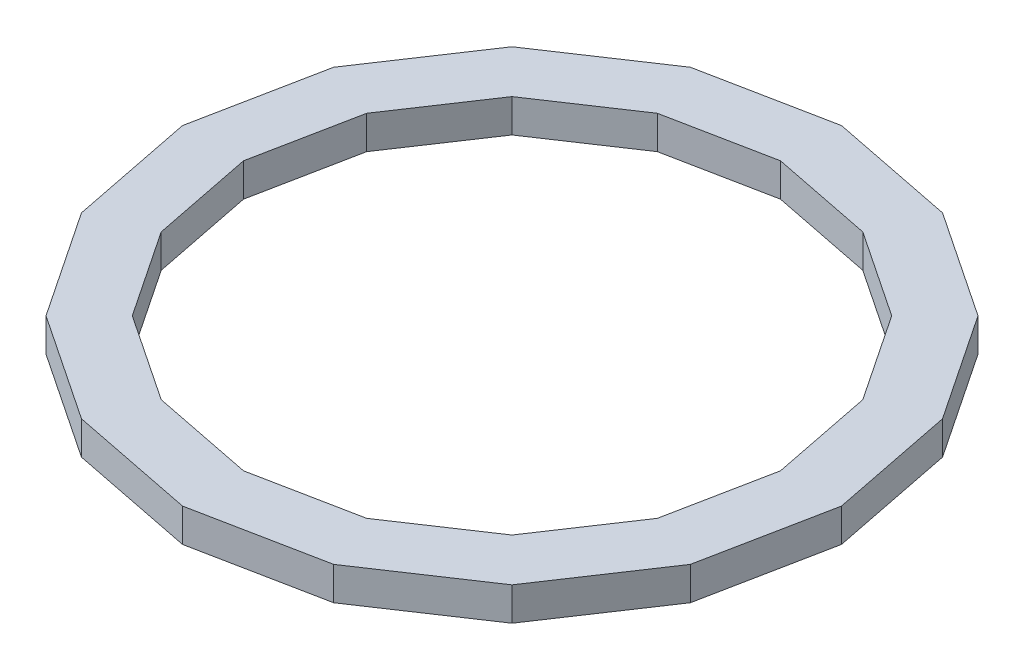
ISO-10303-21;
HEADER;
FILE_DESCRIPTION(('STEP AP214'),'2;1');
FILE_NAME('part.step','',(''),(''),'','','');
FILE_SCHEMA(('AUTOMOTIVE_DESIGN { 1 0 10303 214 1 1 1 1 }'));
ENDSEC;
DATA;
#1=APPLICATION_CONTEXT('core data for automotive mechanical design processes');
#2=APPLICATION_PROTOCOL_DEFINITION('international standard','automotive_design',2000,#1);
#3=PRODUCT_CONTEXT('',#1,'mechanical');
#4=PRODUCT('Part','Part','',(#3));
#5=PRODUCT_RELATED_PRODUCT_CATEGORY('part','',(#4));
#6=PRODUCT_DEFINITION_FORMATION('','',#4);
#7=PRODUCT_DEFINITION_CONTEXT('part definition',#1,'design');
#8=PRODUCT_DEFINITION('design','',#6,#7);
#9=PRODUCT_DEFINITION_SHAPE('','',#8);
#10=(LENGTH_UNIT() NAMED_UNIT(*) SI_UNIT(.MILLI.,.METRE.));
#11=(NAMED_UNIT(*) PLANE_ANGLE_UNIT() SI_UNIT($,.RADIAN.));
#12=(NAMED_UNIT(*) SI_UNIT($,.STERADIAN.) SOLID_ANGLE_UNIT());
#13=UNCERTAINTY_MEASURE_WITH_UNIT(LENGTH_MEASURE(1.E-05),#10,'distance_accuracy_value','');
#14=(GEOMETRIC_REPRESENTATION_CONTEXT(3) GLOBAL_UNCERTAINTY_ASSIGNED_CONTEXT((#13)) GLOBAL_UNIT_ASSIGNED_CONTEXT((#10,
#11,#12)) REPRESENTATION_CONTEXT('',''));
#15=CARTESIAN_POINT('',(0.,0.,0.));
#16=DIRECTION('',(0.,0.,1.));
#17=DIRECTION('',(1.,0.,0.));
#18=AXIS2_PLACEMENT_3D('',#15,#16,#17);
#19=CARTESIAN_POINT('',(0.,19.05,0.));
#20=DIRECTION('',(0.,1.,0.));
#21=DIRECTION('',(0.,0.,1.));
#22=AXIS2_PLACEMENT_3D('',#19,#20,#21);
#23=PLANE('',#22);
#24=DIRECTION('',(0.195090322016117,0.,-0.980785280403233));
#25=VECTOR('',#24,1.);
#26=CARTESIAN_POINT('',(174.413998760932,19.05,72.2446437545));
#27=LINE('',#26,#25);
#28=CARTESIAN_POINT('',(174.413998760932,19.05,72.2446437545));
#29=VERTEX_POINT('',#28);
#30=CARTESIAN_POINT('',(188.784351880639,19.05,-2.06772330459707E-12));
#31=VERTEX_POINT('',#30);
#32=EDGE_CURVE('E367',#29,#31,#27,.T.);
#33=ORIENTED_EDGE('',*,*,#32,.T.);
#34=DIRECTION('',(-0.195090322016139,0.,-0.980785280403228));
#35=VECTOR('',#34,1.);
#36=CARTESIAN_POINT('',(188.784351880639,19.05,-2.06772330459707E-12));
#37=LINE('',#36,#35);
#38=CARTESIAN_POINT('',(174.41399876093,19.05,-72.2446437545037));
#39=VERTEX_POINT('',#38);
#40=EDGE_CURVE('E370',#31,#39,#37,.T.);
#41=ORIENTED_EDGE('',*,*,#40,.T.);
#42=DIRECTION('',(-0.555570233019612,0.,-0.831469612302539));
#43=VECTOR('',#42,1.);
#44=CARTESIAN_POINT('',(174.41399876093,19.05,-72.2446437545037));
#45=LINE('',#44,#43);
#46=CARTESIAN_POINT('',(133.490695396706,19.05,-133.490695396709));
#47=VERTEX_POINT('',#46);
#48=EDGE_CURVE('E373',#39,#47,#45,.T.);
#49=ORIENTED_EDGE('',*,*,#48,.T.);
#50=DIRECTION('',(-0.831469612302551,0.,-0.555570233019593));
#51=VECTOR('',#50,1.);
#52=CARTESIAN_POINT('',(133.490695396706,19.05,-133.490695396709));
#53=LINE('',#52,#51);
#54=CARTESIAN_POINT('',(72.2446437544997,19.05,-174.413998760932));
#55=VERTEX_POINT('',#54);
#56=EDGE_CURVE('E375',#47,#55,#53,.T.);
#57=ORIENTED_EDGE('',*,*,#56,.T.);
#58=DIRECTION('',(-0.980785280403233,0.,-0.195090322016118));
#59=VECTOR('',#58,1.);
#60=CARTESIAN_POINT('',(72.2446437544997,19.05,-174.413998760932));
#61=LINE('',#60,#59);
#62=CARTESIAN_POINT('',(-2.12348109558965E-12,19.05,-188.784351880639));
#63=VERTEX_POINT('',#62);
#64=EDGE_CURVE('E377',#55,#63,#61,.T.);
#65=ORIENTED_EDGE('',*,*,#64,.T.);
#66=DIRECTION('',(-0.980785280403228,0.,0.195090322016139));
#67=VECTOR('',#66,1.);
#68=CARTESIAN_POINT('',(-2.12348109558965E-12,19.05,-188.784351880639));
#69=LINE('',#68,#67);
#70=CARTESIAN_POINT('',(-72.2446437545038,19.05,-174.41399876093));
#71=VERTEX_POINT('',#70);
#72=EDGE_CURVE('E379',#63,#71,#69,.T.);
#73=ORIENTED_EDGE('',*,*,#72,.T.);
#74=DIRECTION('',(-0.831469612302539,0.,0.555570233019611));
#75=VECTOR('',#74,1.);
#76=CARTESIAN_POINT('',(-72.2446437545038,19.05,-174.41399876093));
#77=LINE('',#76,#75);
#78=CARTESIAN_POINT('',(-133.490695396709,19.05,-133.490695396706));
#79=VERTEX_POINT('',#78);
#80=EDGE_CURVE('E381',#71,#79,#77,.T.);
#81=ORIENTED_EDGE('',*,*,#80,.T.);
#82=DIRECTION('',(-0.555570233019593,0.,0.831469612302551));
#83=VECTOR('',#82,1.);
#84=CARTESIAN_POINT('',(-133.490695396709,19.05,-133.490695396706));
#85=LINE('',#84,#83);
#86=CARTESIAN_POINT('',(-174.413998760932,19.05,-72.2446437545));
#87=VERTEX_POINT('',#86);
#88=EDGE_CURVE('E383',#79,#87,#85,.T.);
#89=ORIENTED_EDGE('',*,*,#88,.T.);
#90=DIRECTION('',(-0.195090322016117,0.,0.980785280403233));
#91=VECTOR('',#90,1.);
#92=CARTESIAN_POINT('',(-174.413998760932,19.05,-72.2446437545));
#93=LINE('',#92,#91);
#94=CARTESIAN_POINT('',(-188.784351880639,19.05,2.15799439684234E-12));
#95=VERTEX_POINT('',#94);
#96=EDGE_CURVE('E385',#87,#95,#93,.T.);
#97=ORIENTED_EDGE('',*,*,#96,.T.);
#98=DIRECTION('',(0.195090322016139,0.,0.980785280403228));
#99=VECTOR('',#98,1.);
#100=CARTESIAN_POINT('',(-188.784351880639,19.05,2.15799439684234E-12));
#101=LINE('',#100,#99);
#102=CARTESIAN_POINT('',(-174.41399876093,19.05,72.2446437545039));
#103=VERTEX_POINT('',#102);
#104=EDGE_CURVE('E387',#95,#103,#101,.T.);
#105=ORIENTED_EDGE('',*,*,#104,.T.);
#106=DIRECTION('',(0.555570233019612,0.,0.831469612302539));
#107=VECTOR('',#106,1.);
#108=CARTESIAN_POINT('',(-174.41399876093,19.05,72.2446437545039));
#109=LINE('',#108,#107);
#110=CARTESIAN_POINT('',(-133.490695396706,19.05,133.490695396709));
#111=VERTEX_POINT('',#110);
#112=EDGE_CURVE('E389',#103,#111,#109,.T.);
#113=ORIENTED_EDGE('',*,*,#112,.T.);
#114=DIRECTION('',(0.831469612302551,0.,0.555570233019593));
#115=VECTOR('',#114,1.);
#116=CARTESIAN_POINT('',(-133.490695396706,19.05,133.490695396709));
#117=LINE('',#116,#115);
#118=CARTESIAN_POINT('',(-72.2446437544999,19.05,174.413998760932));
#119=VERTEX_POINT('',#118);
#120=EDGE_CURVE('E391',#111,#119,#117,.T.);
#121=ORIENTED_EDGE('',*,*,#120,.T.);
#122=DIRECTION('',(0.980785280403233,0.,0.195090322016118));
#123=VECTOR('',#122,1.);
#124=CARTESIAN_POINT('',(-72.2446437544999,19.05,174.413998760932));
#125=LINE('',#124,#123);
#126=CARTESIAN_POINT('',(2.13703640645496E-12,19.05,188.784351880639));
#127=VERTEX_POINT('',#126);
#128=EDGE_CURVE('E393',#119,#127,#125,.T.);
#129=ORIENTED_EDGE('',*,*,#128,.T.);
#130=DIRECTION('',(0.980785280403228,0.,-0.195090322016139));
#131=VECTOR('',#130,1.);
#132=CARTESIAN_POINT('',(2.13703640645496E-12,19.05,188.784351880639));
#133=LINE('',#132,#131);
#134=CARTESIAN_POINT('',(72.2446437545038,19.05,174.41399876093));
#135=VERTEX_POINT('',#134);
#136=EDGE_CURVE('E395',#127,#135,#133,.T.);
#137=ORIENTED_EDGE('',*,*,#136,.T.);
#138=DIRECTION('',(0.831469612302539,0.,-0.555570233019611));
#139=VECTOR('',#138,1.);
#140=CARTESIAN_POINT('',(72.2446437545038,19.05,174.41399876093));
#141=LINE('',#140,#139);
#142=CARTESIAN_POINT('',(133.490695396709,19.05,133.490695396706));
#143=VERTEX_POINT('',#142);
#144=EDGE_CURVE('E397',#135,#143,#141,.T.);
#145=ORIENTED_EDGE('',*,*,#144,.T.);
#146=DIRECTION('',(0.555570233019593,0.,-0.831469612302551));
#147=VECTOR('',#146,1.);
#148=CARTESIAN_POINT('',(133.490695396709,19.05,133.490695396706));
#149=LINE('',#148,#147);
#150=EDGE_CURVE('E399',#143,#29,#149,.T.);
#151=ORIENTED_EDGE('',*,*,#150,.T.);
#152=EDGE_LOOP('',(#33,#41,#49,#57,#65,#73,#81,#89,#97,#105,#113,#121,#129,#137,#145,#151));
#153=FACE_BOUND('',#152,.T.);
#154=DIRECTION('',(-0.19509032201614,0.,-0.980785280403228));
#155=VECTOR('',#154,1.);
#156=CARTESIAN_POINT('',(153.822571065676,19.05,-1.83885030120495E-12));
#157=LINE('',#156,#155);
#158=CARTESIAN_POINT('',(153.822571065676,19.05,-1.83885030120495E-12));
#159=VERTEX_POINT('',#158);
#160=CARTESIAN_POINT('',(142.11352504584,19.05,-58.8653494706375));
#161=VERTEX_POINT('',#160);
#162=EDGE_CURVE('E251',#159,#161,#157,.T.);
#163=ORIENTED_EDGE('',*,*,#162,.F.);
#164=DIRECTION('',(0.195090322016117,0.,-0.980785280403233));
#165=VECTOR('',#164,1.);
#166=CARTESIAN_POINT('',(142.113525045842,19.05,58.8653494706343));
#167=LINE('',#166,#165);
#168=CARTESIAN_POINT('',(142.113525045842,19.05,58.8653494706343));
#169=VERTEX_POINT('',#168);
#170=EDGE_CURVE('E243',#169,#159,#167,.T.);
#171=ORIENTED_EDGE('',*,*,#170,.F.);
#172=DIRECTION('',(0.555570233019593,0.,-0.831469612302552));
#173=VECTOR('',#172,1.);
#174=CARTESIAN_POINT('',(108.76898310009,19.05,108.768983100088));
#175=LINE('',#174,#173);
#176=CARTESIAN_POINT('',(108.76898310009,19.05,108.768983100088));
#177=VERTEX_POINT('',#176);
#178=EDGE_CURVE('E293',#177,#169,#175,.T.);
#179=ORIENTED_EDGE('',*,*,#178,.F.);
#180=DIRECTION('',(0.831469612302539,0.,-0.555570233019612));
#181=VECTOR('',#180,1.);
#182=CARTESIAN_POINT('',(58.8653494706375,19.05,142.11352504584));
#183=LINE('',#182,#181);
#184=CARTESIAN_POINT('',(58.8653494706375,19.05,142.11352504584));
#185=VERTEX_POINT('',#184);
#186=EDGE_CURVE('E291',#185,#177,#183,.T.);
#187=ORIENTED_EDGE('',*,*,#186,.F.);
#188=DIRECTION('',(0.980785280403228,0.,-0.19509032201614));
#189=VECTOR('',#188,1.);
#190=CARTESIAN_POINT('',(1.76701626226146E-12,19.05,153.822571065676));
#191=LINE('',#190,#189);
#192=CARTESIAN_POINT('',(1.76701626226146E-12,19.05,153.822571065676));
#193=VERTEX_POINT('',#192);
#194=EDGE_CURVE('E289',#193,#185,#191,.T.);
#195=ORIENTED_EDGE('',*,*,#194,.F.);
#196=DIRECTION('',(0.980785280403233,0.,0.195090322016117));
#197=VECTOR('',#196,1.);
#198=CARTESIAN_POINT('',(-58.8653494706342,19.05,142.113525045842));
#199=LINE('',#198,#197);
#200=CARTESIAN_POINT('',(-58.8653494706342,19.05,142.113525045842));
#201=VERTEX_POINT('',#200);
#202=EDGE_CURVE('E287',#201,#193,#199,.T.);
#203=ORIENTED_EDGE('',*,*,#202,.F.);
#204=DIRECTION('',(0.831469612302552,0.,0.555570233019593));
#205=VECTOR('',#204,1.);
#206=CARTESIAN_POINT('',(-108.768983100088,19.05,108.76898310009));
#207=LINE('',#206,#205);
#208=CARTESIAN_POINT('',(-108.768983100088,19.05,108.76898310009));
#209=VERTEX_POINT('',#208);
#210=EDGE_CURVE('E285',#209,#201,#207,.T.);
#211=ORIENTED_EDGE('',*,*,#210,.F.);
#212=DIRECTION('',(0.555570233019612,0.,0.831469612302539));
#213=VECTOR('',#212,1.);
#214=CARTESIAN_POINT('',(-142.11352504584,19.05,58.8653494706376));
#215=LINE('',#214,#213);
#216=CARTESIAN_POINT('',(-142.11352504584,19.05,58.8653494706376));
#217=VERTEX_POINT('',#216);
#218=EDGE_CURVE('E283',#217,#209,#215,.T.);
#219=ORIENTED_EDGE('',*,*,#218,.F.);
#220=DIRECTION('',(0.19509032201614,0.,0.980785280403228));
#221=VECTOR('',#220,1.);
#222=CARTESIAN_POINT('',(-153.822571065676,19.05,1.7398533574002E-12));
#223=LINE('',#222,#221);
#224=CARTESIAN_POINT('',(-153.822571065676,19.05,1.7398533574002E-12));
#225=VERTEX_POINT('',#224);
#226=EDGE_CURVE('E280',#225,#217,#223,.T.);
#227=ORIENTED_EDGE('',*,*,#226,.F.);
#228=DIRECTION('',(-0.195090322016118,0.,0.980785280403233));
#229=VECTOR('',#228,1.);
#230=CARTESIAN_POINT('',(-142.113525045842,19.05,-58.8653494706341));
#231=LINE('',#230,#229);
#232=CARTESIAN_POINT('',(-142.113525045842,19.05,-58.8653494706341));
#233=VERTEX_POINT('',#232);
#234=EDGE_CURVE('E278',#233,#225,#231,.T.);
#235=ORIENTED_EDGE('',*,*,#234,.F.);
#236=DIRECTION('',(-0.555570233019593,0.,0.831469612302552));
#237=VECTOR('',#236,1.);
#238=CARTESIAN_POINT('',(-108.76898310009,19.05,-108.768983100088));
#239=LINE('',#238,#237);
#240=CARTESIAN_POINT('',(-108.76898310009,19.05,-108.768983100088));
#241=VERTEX_POINT('',#240);
#242=EDGE_CURVE('E276',#241,#233,#239,.T.);
#243=ORIENTED_EDGE('',*,*,#242,.F.);
#244=DIRECTION('',(-0.831469612302539,0.,0.555570233019612));
#245=VECTOR('',#244,1.);
#246=CARTESIAN_POINT('',(-58.8653494706374,19.05,-142.11352504584));
#247=LINE('',#246,#245);
#248=CARTESIAN_POINT('',(-58.8653494706374,19.05,-142.11352504584));
#249=VERTEX_POINT('',#248);
#250=EDGE_CURVE('E274',#249,#241,#247,.T.);
#251=ORIENTED_EDGE('',*,*,#250,.F.);
#252=DIRECTION('',(-0.980785280403228,0.,0.19509032201614));
#253=VECTOR('',#252,1.);
#254=CARTESIAN_POINT('',(-1.79028854164024E-12,19.05,-153.822571065676));
#255=LINE('',#254,#253);
#256=CARTESIAN_POINT('',(-1.79028854164024E-12,19.05,-153.822571065676));
#257=VERTEX_POINT('',#256);
#258=EDGE_CURVE('E272',#257,#249,#255,.T.);
#259=ORIENTED_EDGE('',*,*,#258,.F.);
#260=DIRECTION('',(-0.980785280403233,0.,-0.195090322016117));
#261=VECTOR('',#260,1.);
#262=CARTESIAN_POINT('',(58.8653494706345,19.05,-142.113525045841));
#263=LINE('',#262,#261);
#264=CARTESIAN_POINT('',(58.8653494706345,19.05,-142.113525045841));
#265=VERTEX_POINT('',#264);
#266=EDGE_CURVE('E270',#265,#257,#263,.T.);
#267=ORIENTED_EDGE('',*,*,#266,.F.);
#268=DIRECTION('',(-0.831469612302551,0.,-0.555570233019593));
#269=VECTOR('',#268,1.);
#270=CARTESIAN_POINT('',(108.768983100088,19.05,-108.76898310009));
#271=LINE('',#270,#269);
#272=CARTESIAN_POINT('',(108.768983100088,19.05,-108.76898310009));
#273=VERTEX_POINT('',#272);
#274=EDGE_CURVE('E266',#273,#265,#271,.T.);
#275=ORIENTED_EDGE('',*,*,#274,.F.);
#276=DIRECTION('',(-0.555570233019612,0.,-0.831469612302539));
#277=VECTOR('',#276,1.);
#278=CARTESIAN_POINT('',(142.11352504584,19.05,-58.8653494706375));
#279=LINE('',#278,#277);
#280=EDGE_CURVE('E264',#161,#273,#279,.T.);
#281=ORIENTED_EDGE('',*,*,#280,.F.);
#282=EDGE_LOOP('',(#163,#171,#179,#187,#195,#203,#211,#219,#227,#235,#243,#251,#259,#267,#275,#281));
#283=FACE_BOUND('',#282,.T.);
#284=ADVANCED_FACE('F34',(#153,#283),#23,.T.);
#285=CARTESIAN_POINT('',(0.,0.,0.));
#286=DIRECTION('',(0.,1.,0.));
#287=DIRECTION('',(0.,0.,1.));
#288=AXIS2_PLACEMENT_3D('',#285,#286,#287);
#289=PLANE('',#288);
#290=DIRECTION('',(0.195090322016117,0.,-0.980785280403233));
#291=VECTOR('',#290,1.);
#292=CARTESIAN_POINT('',(174.413998760932,0.,72.2446437545));
#293=LINE('',#292,#291);
#294=CARTESIAN_POINT('',(174.413998760932,0.,72.2446437545));
#295=VERTEX_POINT('',#294);
#296=CARTESIAN_POINT('',(188.784351880639,0.,-2.06772330459707E-12));
#297=VERTEX_POINT('',#296);
#298=EDGE_CURVE('E259',#295,#297,#293,.T.);
#299=ORIENTED_EDGE('',*,*,#298,.F.);
#300=DIRECTION('',(0.555570233019593,0.,-0.831469612302551));
#301=VECTOR('',#300,1.);
#302=CARTESIAN_POINT('',(133.490695396709,0.,133.490695396706));
#303=LINE('',#302,#301);
#304=CARTESIAN_POINT('',(133.490695396709,0.,133.490695396706));
#305=VERTEX_POINT('',#304);
#306=EDGE_CURVE('E371',#305,#295,#303,.T.);
#307=ORIENTED_EDGE('',*,*,#306,.F.);
#308=DIRECTION('',(0.831469612302539,0.,-0.555570233019611));
#309=VECTOR('',#308,1.);
#310=CARTESIAN_POINT('',(72.2446437545038,0.,174.41399876093));
#311=LINE('',#310,#309);
#312=CARTESIAN_POINT('',(72.2446437545038,0.,174.41399876093));
#313=VERTEX_POINT('',#312);
#314=EDGE_CURVE('E432',#313,#305,#311,.T.);
#315=ORIENTED_EDGE('',*,*,#314,.F.);
#316=DIRECTION('',(0.980785280403228,0.,-0.195090322016139));
#317=VECTOR('',#316,1.);
#318=CARTESIAN_POINT('',(2.13703640645496E-12,0.,188.784351880639));
#319=LINE('',#318,#317);
#320=CARTESIAN_POINT('',(2.13703640645496E-12,0.,188.784351880639));
#321=VERTEX_POINT('',#320);
#322=EDGE_CURVE('E430',#321,#313,#319,.T.);
#323=ORIENTED_EDGE('',*,*,#322,.F.);
#324=DIRECTION('',(0.980785280403233,0.,0.195090322016118));
#325=VECTOR('',#324,1.);
#326=CARTESIAN_POINT('',(-72.2446437544999,0.,174.413998760932));
#327=LINE('',#326,#325);
#328=CARTESIAN_POINT('',(-72.2446437544999,0.,174.413998760932));
#329=VERTEX_POINT('',#328);
#330=EDGE_CURVE('E428',#329,#321,#327,.T.);
#331=ORIENTED_EDGE('',*,*,#330,.F.);
#332=DIRECTION('',(0.831469612302551,0.,0.555570233019593));
#333=VECTOR('',#332,1.);
#334=CARTESIAN_POINT('',(-133.490695396706,0.,133.490695396709));
#335=LINE('',#334,#333);
#336=CARTESIAN_POINT('',(-133.490695396706,0.,133.490695396709));
#337=VERTEX_POINT('',#336);
#338=EDGE_CURVE('E426',#337,#329,#335,.T.);
#339=ORIENTED_EDGE('',*,*,#338,.F.);
#340=DIRECTION('',(0.555570233019612,0.,0.831469612302539));
#341=VECTOR('',#340,1.);
#342=CARTESIAN_POINT('',(-174.41399876093,0.,72.2446437545039));
#343=LINE('',#342,#341);
#344=CARTESIAN_POINT('',(-174.41399876093,0.,72.2446437545039));
#345=VERTEX_POINT('',#344);
#346=EDGE_CURVE('E424',#345,#337,#343,.T.);
#347=ORIENTED_EDGE('',*,*,#346,.F.);
#348=DIRECTION('',(0.195090322016139,0.,0.980785280403228));
#349=VECTOR('',#348,1.);
#350=CARTESIAN_POINT('',(-188.784351880639,0.,2.15799439684234E-12));
#351=LINE('',#350,#349);
#352=CARTESIAN_POINT('',(-188.784351880639,0.,2.15799439684234E-12));
#353=VERTEX_POINT('',#352);
#354=EDGE_CURVE('E422',#353,#345,#351,.T.);
#355=ORIENTED_EDGE('',*,*,#354,.F.);
#356=DIRECTION('',(-0.195090322016117,0.,0.980785280403233));
#357=VECTOR('',#356,1.);
#358=CARTESIAN_POINT('',(-174.413998760932,0.,-72.2446437545));
#359=LINE('',#358,#357);
#360=CARTESIAN_POINT('',(-174.413998760932,0.,-72.2446437545));
#361=VERTEX_POINT('',#360);
#362=EDGE_CURVE('E419',#361,#353,#359,.T.);
#363=ORIENTED_EDGE('',*,*,#362,.F.);
#364=DIRECTION('',(-0.555570233019593,0.,0.831469612302551));
#365=VECTOR('',#364,1.);
#366=CARTESIAN_POINT('',(-133.490695396709,0.,-133.490695396706));
#367=LINE('',#366,#365);
#368=CARTESIAN_POINT('',(-133.490695396709,0.,-133.490695396706));
#369=VERTEX_POINT('',#368);
#370=EDGE_CURVE('E417',#369,#361,#367,.T.);
#371=ORIENTED_EDGE('',*,*,#370,.F.);
#372=DIRECTION('',(-0.831469612302539,0.,0.555570233019611));
#373=VECTOR('',#372,1.);
#374=CARTESIAN_POINT('',(-72.2446437545038,0.,-174.41399876093));
#375=LINE('',#374,#373);
#376=CARTESIAN_POINT('',(-72.2446437545038,0.,-174.41399876093));
#377=VERTEX_POINT('',#376);
#378=EDGE_CURVE('E415',#377,#369,#375,.T.);
#379=ORIENTED_EDGE('',*,*,#378,.F.);
#380=DIRECTION('',(-0.980785280403228,0.,0.195090322016139));
#381=VECTOR('',#380,1.);
#382=CARTESIAN_POINT('',(-2.12348109558965E-12,0.,-188.784351880639));
#383=LINE('',#382,#381);
#384=CARTESIAN_POINT('',(-2.12348109558965E-12,0.,-188.784351880639));
#385=VERTEX_POINT('',#384);
#386=EDGE_CURVE('E413',#385,#377,#383,.T.);
#387=ORIENTED_EDGE('',*,*,#386,.F.);
#388=DIRECTION('',(-0.980785280403233,0.,-0.195090322016118));
#389=VECTOR('',#388,1.);
#390=CARTESIAN_POINT('',(72.2446437544997,0.,-174.413998760932));
#391=LINE('',#390,#389);
#392=CARTESIAN_POINT('',(72.2446437544997,0.,-174.413998760932));
#393=VERTEX_POINT('',#392);
#394=EDGE_CURVE('E411',#393,#385,#391,.T.);
#395=ORIENTED_EDGE('',*,*,#394,.F.);
#396=DIRECTION('',(-0.831469612302551,0.,-0.555570233019593));
#397=VECTOR('',#396,1.);
#398=CARTESIAN_POINT('',(133.490695396706,0.,-133.490695396709));
#399=LINE('',#398,#397);
#400=CARTESIAN_POINT('',(133.490695396706,0.,-133.490695396709));
#401=VERTEX_POINT('',#400);
#402=EDGE_CURVE('E409',#401,#393,#399,.T.);
#403=ORIENTED_EDGE('',*,*,#402,.F.);
#404=DIRECTION('',(-0.555570233019612,0.,-0.831469612302539));
#405=VECTOR('',#404,1.);
#406=CARTESIAN_POINT('',(174.41399876093,0.,-72.2446437545037));
#407=LINE('',#406,#405);
#408=CARTESIAN_POINT('',(174.41399876093,0.,-72.2446437545037));
#409=VERTEX_POINT('',#408);
#410=EDGE_CURVE('E406',#409,#401,#407,.T.);
#411=ORIENTED_EDGE('',*,*,#410,.F.);
#412=DIRECTION('',(-0.195090322016139,0.,-0.980785280403228));
#413=VECTOR('',#412,1.);
#414=CARTESIAN_POINT('',(188.784351880639,0.,-2.06772330459707E-12));
#415=LINE('',#414,#413);
#416=EDGE_CURVE('E404',#297,#409,#415,.T.);
#417=ORIENTED_EDGE('',*,*,#416,.F.);
#418=EDGE_LOOP('',(#299,#307,#315,#323,#331,#339,#347,#355,#363,#371,#379,#387,#395,#403,#411,#417));
#419=FACE_BOUND('',#418,.T.);
#420=DIRECTION('',(0.195090322016117,0.,-0.980785280403233));
#421=VECTOR('',#420,1.);
#422=CARTESIAN_POINT('',(142.113525045842,0.,58.8653494706343));
#423=LINE('',#422,#421);
#424=CARTESIAN_POINT('',(142.113525045842,0.,58.8653494706343));
#425=VERTEX_POINT('',#424);
#426=CARTESIAN_POINT('',(153.822571065676,0.,-1.83885030120495E-12));
#427=VERTEX_POINT('',#426);
#428=EDGE_CURVE('E57',#425,#427,#423,.T.);
#429=ORIENTED_EDGE('',*,*,#428,.T.);
#430=DIRECTION('',(-0.19509032201614,0.,-0.980785280403228));
#431=VECTOR('',#430,1.);
#432=CARTESIAN_POINT('',(153.822571065676,0.,-1.83885030120495E-12));
#433=LINE('',#432,#431);
#434=CARTESIAN_POINT('',(142.11352504584,0.,-58.8653494706375));
#435=VERTEX_POINT('',#434);
#436=EDGE_CURVE('E258',#427,#435,#433,.T.);
#437=ORIENTED_EDGE('',*,*,#436,.T.);
#438=DIRECTION('',(-0.555570233019612,0.,-0.831469612302539));
#439=VECTOR('',#438,1.);
#440=CARTESIAN_POINT('',(142.11352504584,0.,-58.8653494706375));
#441=LINE('',#440,#439);
#442=CARTESIAN_POINT('',(108.768983100088,0.,-108.76898310009));
#443=VERTEX_POINT('',#442);
#444=EDGE_CURVE('E297',#435,#443,#441,.T.);
#445=ORIENTED_EDGE('',*,*,#444,.T.);
#446=DIRECTION('',(-0.831469612302551,0.,-0.555570233019593));
#447=VECTOR('',#446,1.);
#448=CARTESIAN_POINT('',(108.768983100088,0.,-108.76898310009));
#449=LINE('',#448,#447);
#450=CARTESIAN_POINT('',(58.8653494706345,0.,-142.113525045841));
#451=VERTEX_POINT('',#450);
#452=EDGE_CURVE('E300',#443,#451,#449,.T.);
#453=ORIENTED_EDGE('',*,*,#452,.T.);
#454=DIRECTION('',(-0.980785280403233,0.,-0.195090322016117));
#455=VECTOR('',#454,1.);
#456=CARTESIAN_POINT('',(58.8653494706345,0.,-142.113525045841));
#457=LINE('',#456,#455);
#458=CARTESIAN_POINT('',(-1.79028854164024E-12,0.,-153.822571065676));
#459=VERTEX_POINT('',#458);
#460=EDGE_CURVE('E304',#451,#459,#457,.T.);
#461=ORIENTED_EDGE('',*,*,#460,.T.);
#462=DIRECTION('',(-0.980785280403228,0.,0.19509032201614));
#463=VECTOR('',#462,1.);
#464=CARTESIAN_POINT('',(-1.79028854164024E-12,0.,-153.822571065676));
#465=LINE('',#464,#463);
#466=CARTESIAN_POINT('',(-58.8653494706374,0.,-142.11352504584));
#467=VERTEX_POINT('',#466);
#468=EDGE_CURVE('E307',#459,#467,#465,.T.);
#469=ORIENTED_EDGE('',*,*,#468,.T.);
#470=DIRECTION('',(-0.831469612302539,0.,0.555570233019612));
#471=VECTOR('',#470,1.);
#472=CARTESIAN_POINT('',(-58.8653494706374,0.,-142.11352504584));
#473=LINE('',#472,#471);
#474=CARTESIAN_POINT('',(-108.76898310009,0.,-108.768983100088));
#475=VERTEX_POINT('',#474);
#476=EDGE_CURVE('E310',#467,#475,#473,.T.);
#477=ORIENTED_EDGE('',*,*,#476,.T.);
#478=DIRECTION('',(-0.555570233019593,0.,0.831469612302552));
#479=VECTOR('',#478,1.);
#480=CARTESIAN_POINT('',(-108.76898310009,0.,-108.768983100088));
#481=LINE('',#480,#479);
#482=CARTESIAN_POINT('',(-142.113525045842,0.,-58.8653494706341));
#483=VERTEX_POINT('',#482);
#484=EDGE_CURVE('E313',#475,#483,#481,.T.);
#485=ORIENTED_EDGE('',*,*,#484,.T.);
#486=DIRECTION('',(-0.195090322016118,0.,0.980785280403233));
#487=VECTOR('',#486,1.);
#488=CARTESIAN_POINT('',(-142.113525045842,0.,-58.8653494706341));
#489=LINE('',#488,#487);
#490=CARTESIAN_POINT('',(-153.822571065676,0.,1.7398533574002E-12));
#491=VERTEX_POINT('',#490);
#492=EDGE_CURVE('E316',#483,#491,#489,.T.);
#493=ORIENTED_EDGE('',*,*,#492,.T.);
#494=DIRECTION('',(0.19509032201614,0.,0.980785280403228));
#495=VECTOR('',#494,1.);
#496=CARTESIAN_POINT('',(-153.822571065676,0.,1.7398533574002E-12));
#497=LINE('',#496,#495);
#498=CARTESIAN_POINT('',(-142.11352504584,0.,58.8653494706376));
#499=VERTEX_POINT('',#498);
#500=EDGE_CURVE('E319',#491,#499,#497,.T.);
#501=ORIENTED_EDGE('',*,*,#500,.T.);
#502=DIRECTION('',(0.555570233019612,0.,0.831469612302539));
#503=VECTOR('',#502,1.);
#504=CARTESIAN_POINT('',(-142.11352504584,0.,58.8653494706376));
#505=LINE('',#504,#503);
#506=CARTESIAN_POINT('',(-108.768983100088,0.,108.76898310009));
#507=VERTEX_POINT('',#506);
#508=EDGE_CURVE('E322',#499,#507,#505,.T.);
#509=ORIENTED_EDGE('',*,*,#508,.T.);
#510=DIRECTION('',(0.831469612302552,0.,0.555570233019593));
#511=VECTOR('',#510,1.);
#512=CARTESIAN_POINT('',(-108.768983100088,0.,108.76898310009));
#513=LINE('',#512,#511);
#514=CARTESIAN_POINT('',(-58.8653494706342,0.,142.113525045842));
#515=VERTEX_POINT('',#514);
#516=EDGE_CURVE('E325',#507,#515,#513,.T.);
#517=ORIENTED_EDGE('',*,*,#516,.T.);
#518=DIRECTION('',(0.980785280403233,0.,0.195090322016117));
#519=VECTOR('',#518,1.);
#520=CARTESIAN_POINT('',(-58.8653494706342,0.,142.113525045842));
#521=LINE('',#520,#519);
#522=CARTESIAN_POINT('',(1.76701626226146E-12,0.,153.822571065676));
#523=VERTEX_POINT('',#522);
#524=EDGE_CURVE('E328',#515,#523,#521,.T.);
#525=ORIENTED_EDGE('',*,*,#524,.T.);
#526=DIRECTION('',(0.980785280403228,0.,-0.19509032201614));
#527=VECTOR('',#526,1.);
#528=CARTESIAN_POINT('',(1.76701626226146E-12,0.,153.822571065676));
#529=LINE('',#528,#527);
#530=CARTESIAN_POINT('',(58.8653494706375,0.,142.11352504584));
#531=VERTEX_POINT('',#530);
#532=EDGE_CURVE('E332',#523,#531,#529,.T.);
#533=ORIENTED_EDGE('',*,*,#532,.T.);
#534=DIRECTION('',(0.831469612302539,0.,-0.555570233019612));
#535=VECTOR('',#534,1.);
#536=CARTESIAN_POINT('',(58.8653494706375,0.,142.11352504584));
#537=LINE('',#536,#535);
#538=CARTESIAN_POINT('',(108.76898310009,0.,108.768983100088));
#539=VERTEX_POINT('',#538);
#540=EDGE_CURVE('E335',#531,#539,#537,.T.);
#541=ORIENTED_EDGE('',*,*,#540,.T.);
#542=DIRECTION('',(0.555570233019593,0.,-0.831469612302552));
#543=VECTOR('',#542,1.);
#544=CARTESIAN_POINT('',(108.76898310009,0.,108.768983100088));
#545=LINE('',#544,#543);
#546=EDGE_CURVE('E252',#539,#425,#545,.T.);
#547=ORIENTED_EDGE('',*,*,#546,.T.);
#548=EDGE_LOOP('',(#429,#437,#445,#453,#461,#469,#477,#485,#493,#501,#509,#517,#525,#533,#541,#547));
#549=FACE_BOUND('',#548,.T.);
#550=ADVANCED_FACE('F491',(#419,#549),#289,.F.);
#551=CARTESIAN_POINT('',(174.413998760932,19.05,72.2446437545));
#552=DIRECTION('',(-0.980785280403233,0.,-0.195090322016117));
#553=DIRECTION('',(-0.195090322016117,0.,0.980785280403233));
#554=AXIS2_PLACEMENT_3D('',#551,#552,#553);
#555=PLANE('',#554);
#556=ORIENTED_EDGE('',*,*,#298,.T.);
#557=DIRECTION('',(0.,-1.,0.));
#558=VECTOR('',#557,1.);
#559=CARTESIAN_POINT('',(188.784351880639,19.05,-2.06772330459707E-12));
#560=LINE('',#559,#558);
#561=EDGE_CURVE('E11',#31,#297,#560,.T.);
#562=ORIENTED_EDGE('',*,*,#561,.F.);
#563=ORIENTED_EDGE('',*,*,#32,.F.);
#564=DIRECTION('',(0.,-1.,0.));
#565=VECTOR('',#564,1.);
#566=CARTESIAN_POINT('',(174.413998760932,19.05,72.2446437545));
#567=LINE('',#566,#565);
#568=EDGE_CURVE('E401',#29,#295,#567,.T.);
#569=ORIENTED_EDGE('',*,*,#568,.T.);
#570=EDGE_LOOP('',(#556,#562,#563,#569));
#571=FACE_BOUND('',#570,.T.);
#572=ADVANCED_FACE('F36',(#571),#555,.F.);
#573=CARTESIAN_POINT('',(188.784351880639,19.05,-2.06772330459707E-12));
#574=DIRECTION('',(-0.980785280403228,0.,0.195090322016139));
#575=DIRECTION('',(0.195090322016139,0.,0.980785280403228));
#576=AXIS2_PLACEMENT_3D('',#573,#574,#575);
#577=PLANE('',#576);
#578=ORIENTED_EDGE('',*,*,#416,.T.);
#579=DIRECTION('',(0.,-1.,0.));
#580=VECTOR('',#579,1.);
#581=CARTESIAN_POINT('',(174.41399876093,19.05,-72.2446437545037));
#582=LINE('',#581,#580);
#583=EDGE_CURVE('E42',#39,#409,#582,.T.);
#584=ORIENTED_EDGE('',*,*,#583,.F.);
#585=ORIENTED_EDGE('',*,*,#40,.F.);
#586=ORIENTED_EDGE('',*,*,#561,.T.);
#587=EDGE_LOOP('',(#578,#584,#585,#586));
#588=FACE_BOUND('',#587,.T.);
#589=ADVANCED_FACE('F508',(#588),#577,.F.);
#590=CARTESIAN_POINT('',(174.41399876093,19.05,-72.2446437545037));
#591=DIRECTION('',(-0.831469612302539,0.,0.555570233019612));
#592=DIRECTION('',(0.555570233019612,0.,0.831469612302539));
#593=AXIS2_PLACEMENT_3D('',#590,#591,#592);
#594=PLANE('',#593);
#595=ORIENTED_EDGE('',*,*,#410,.T.);
#596=DIRECTION('',(0.,-1.,0.));
#597=VECTOR('',#596,1.);
#598=CARTESIAN_POINT('',(133.490695396706,19.05,-133.490695396709));
#599=LINE('',#598,#597);
#600=EDGE_CURVE('E478',#47,#401,#599,.T.);
#601=ORIENTED_EDGE('',*,*,#600,.F.);
#602=ORIENTED_EDGE('',*,*,#48,.F.);
#603=ORIENTED_EDGE('',*,*,#583,.T.);
#604=EDGE_LOOP('',(#595,#601,#602,#603));
#605=FACE_BOUND('',#604,.T.);
#606=ADVANCED_FACE('F485',(#605),#594,.F.);
#607=CARTESIAN_POINT('',(133.490695396706,19.05,-133.490695396709));
#608=DIRECTION('',(-0.555570233019593,0.,0.831469612302552));
#609=DIRECTION('',(0.831469612302552,0.,0.555570233019593));
#610=AXIS2_PLACEMENT_3D('',#607,#608,#609);
#611=PLANE('',#610);
#612=ORIENTED_EDGE('',*,*,#402,.T.);
#613=DIRECTION('',(0.,-1.,0.));
#614=VECTOR('',#613,1.);
#615=CARTESIAN_POINT('',(72.2446437544997,19.05,-174.413998760932));
#616=LINE('',#615,#614);
#617=EDGE_CURVE('E475',#55,#393,#616,.T.);
#618=ORIENTED_EDGE('',*,*,#617,.F.);
#619=ORIENTED_EDGE('',*,*,#56,.F.);
#620=ORIENTED_EDGE('',*,*,#600,.T.);
#621=EDGE_LOOP('',(#612,#618,#619,#620));
#622=FACE_BOUND('',#621,.T.);
#623=ADVANCED_FACE('F497',(#622),#611,.F.);
#624=CARTESIAN_POINT('',(72.2446437544997,19.05,-174.413998760932));
#625=DIRECTION('',(-0.195090322016118,0.,0.980785280403233));
#626=DIRECTION('',(0.980785280403233,0.,0.195090322016118));
#627=AXIS2_PLACEMENT_3D('',#624,#625,#626);
#628=PLANE('',#627);
#629=ORIENTED_EDGE('',*,*,#394,.T.);
#630=DIRECTION('',(0.,-1.,0.));
#631=VECTOR('',#630,1.);
#632=CARTESIAN_POINT('',(-2.12348109558965E-12,19.05,-188.784351880639));
#633=LINE('',#632,#631);
#634=EDGE_CURVE('E472',#63,#385,#633,.T.);
#635=ORIENTED_EDGE('',*,*,#634,.F.);
#636=ORIENTED_EDGE('',*,*,#64,.F.);
#637=ORIENTED_EDGE('',*,*,#617,.T.);
#638=EDGE_LOOP('',(#629,#635,#636,#637));
#639=FACE_BOUND('',#638,.T.);
#640=ADVANCED_FACE('F501',(#639),#628,.F.);
#641=CARTESIAN_POINT('',(-2.12348109558965E-12,19.05,-188.784351880639));
#642=DIRECTION('',(0.195090322016139,0.,0.980785280403228));
#643=DIRECTION('',(0.980785280403228,0.,-0.195090322016139));
#644=AXIS2_PLACEMENT_3D('',#641,#642,#643);
#645=PLANE('',#644);
#646=ORIENTED_EDGE('',*,*,#386,.T.);
#647=DIRECTION('',(0.,-1.,0.));
#648=VECTOR('',#647,1.);
#649=CARTESIAN_POINT('',(-72.2446437545038,19.05,-174.41399876093));
#650=LINE('',#649,#648);
#651=EDGE_CURVE('E469',#71,#377,#650,.T.);
#652=ORIENTED_EDGE('',*,*,#651,.F.);
#653=ORIENTED_EDGE('',*,*,#72,.F.);
#654=ORIENTED_EDGE('',*,*,#634,.T.);
#655=EDGE_LOOP('',(#646,#652,#653,#654));
#656=FACE_BOUND('',#655,.T.);
#657=ADVANCED_FACE('F561',(#656),#645,.F.);
#658=CARTESIAN_POINT('',(-72.2446437545038,19.05,-174.41399876093));
#659=DIRECTION('',(0.555570233019611,0.,0.831469612302539));
#660=DIRECTION('',(0.831469612302539,0.,-0.555570233019611));
#661=AXIS2_PLACEMENT_3D('',#658,#659,#660);
#662=PLANE('',#661);
#663=ORIENTED_EDGE('',*,*,#378,.T.);
#664=DIRECTION('',(0.,-1.,0.));
#665=VECTOR('',#664,1.);
#666=CARTESIAN_POINT('',(-133.490695396709,19.05,-133.490695396706));
#667=LINE('',#666,#665);
#668=EDGE_CURVE('E466',#79,#369,#667,.T.);
#669=ORIENTED_EDGE('',*,*,#668,.F.);
#670=ORIENTED_EDGE('',*,*,#80,.F.);
#671=ORIENTED_EDGE('',*,*,#651,.T.);
#672=EDGE_LOOP('',(#663,#669,#670,#671));
#673=FACE_BOUND('',#672,.T.);
#674=ADVANCED_FACE('F558',(#673),#662,.F.);
#675=CARTESIAN_POINT('',(-133.490695396709,19.05,-133.490695396706));
#676=DIRECTION('',(0.831469612302551,0.,0.555570233019593));
#677=DIRECTION('',(0.555570233019593,0.,-0.831469612302551));
#678=AXIS2_PLACEMENT_3D('',#675,#676,#677);
#679=PLANE('',#678);
#680=ORIENTED_EDGE('',*,*,#370,.T.);
#681=DIRECTION('',(0.,-1.,0.));
#682=VECTOR('',#681,1.);
#683=CARTESIAN_POINT('',(-174.413998760932,19.05,-72.2446437545));
#684=LINE('',#683,#682);
#685=EDGE_CURVE('E462',#87,#361,#684,.T.);
#686=ORIENTED_EDGE('',*,*,#685,.F.);
#687=ORIENTED_EDGE('',*,*,#88,.F.);
#688=ORIENTED_EDGE('',*,*,#668,.T.);
#689=EDGE_LOOP('',(#680,#686,#687,#688));
#690=FACE_BOUND('',#689,.T.);
#691=ADVANCED_FACE('F554',(#690),#679,.F.);
#692=CARTESIAN_POINT('',(-174.413998760932,19.05,-72.2446437545));
#693=DIRECTION('',(0.980785280403233,0.,0.195090322016117));
#694=DIRECTION('',(0.195090322016117,0.,-0.980785280403233));
#695=AXIS2_PLACEMENT_3D('',#692,#693,#694);
#696=PLANE('',#695);
#697=ORIENTED_EDGE('',*,*,#362,.T.);
#698=DIRECTION('',(0.,-1.,0.));
#699=VECTOR('',#698,1.);
#700=CARTESIAN_POINT('',(-188.784351880639,19.05,2.15799439684234E-12));
#701=LINE('',#700,#699);
#702=EDGE_CURVE('E459',#95,#353,#701,.T.);
#703=ORIENTED_EDGE('',*,*,#702,.F.);
#704=ORIENTED_EDGE('',*,*,#96,.F.);
#705=ORIENTED_EDGE('',*,*,#685,.T.);
#706=EDGE_LOOP('',(#697,#703,#704,#705));
#707=FACE_BOUND('',#706,.T.);
#708=ADVANCED_FACE('F550',(#707),#696,.F.);
#709=CARTESIAN_POINT('',(-188.784351880639,19.05,2.15799439684234E-12));
#710=DIRECTION('',(0.980785280403228,0.,-0.195090322016139));
#711=DIRECTION('',(-0.195090322016139,0.,-0.980785280403228));
#712=AXIS2_PLACEMENT_3D('',#709,#710,#711);
#713=PLANE('',#712);
#714=ORIENTED_EDGE('',*,*,#354,.T.);
#715=DIRECTION('',(0.,-1.,0.));
#716=VECTOR('',#715,1.);
#717=CARTESIAN_POINT('',(-174.41399876093,19.05,72.2446437545039));
#718=LINE('',#717,#716);
#719=EDGE_CURVE('E456',#103,#345,#718,.T.);
#720=ORIENTED_EDGE('',*,*,#719,.F.);
#721=ORIENTED_EDGE('',*,*,#104,.F.);
#722=ORIENTED_EDGE('',*,*,#702,.T.);
#723=EDGE_LOOP('',(#714,#720,#721,#722));
#724=FACE_BOUND('',#723,.T.);
#725=ADVANCED_FACE('F545',(#724),#713,.F.);
#726=CARTESIAN_POINT('',(-174.41399876093,19.05,72.2446437545039));
#727=DIRECTION('',(0.831469612302539,0.,-0.555570233019612));
#728=DIRECTION('',(-0.555570233019612,0.,-0.831469612302539));
#729=AXIS2_PLACEMENT_3D('',#726,#727,#728);
#730=PLANE('',#729);
#731=ORIENTED_EDGE('',*,*,#346,.T.);
#732=DIRECTION('',(0.,-1.,0.));
#733=VECTOR('',#732,1.);
#734=CARTESIAN_POINT('',(-133.490695396706,19.05,133.490695396709));
#735=LINE('',#734,#733);
#736=EDGE_CURVE('E453',#111,#337,#735,.T.);
#737=ORIENTED_EDGE('',*,*,#736,.F.);
#738=ORIENTED_EDGE('',*,*,#112,.F.);
#739=ORIENTED_EDGE('',*,*,#719,.T.);
#740=EDGE_LOOP('',(#731,#737,#738,#739));
#741=FACE_BOUND('',#740,.T.);
#742=ADVANCED_FACE('F539',(#741),#730,.F.);
#743=CARTESIAN_POINT('',(-133.490695396706,19.05,133.490695396709));
#744=DIRECTION('',(0.555570233019593,0.,-0.831469612302552));
#745=DIRECTION('',(-0.831469612302552,0.,-0.555570233019593));
#746=AXIS2_PLACEMENT_3D('',#743,#744,#745);
#747=PLANE('',#746);
#748=ORIENTED_EDGE('',*,*,#338,.T.);
#749=DIRECTION('',(0.,-1.,0.));
#750=VECTOR('',#749,1.);
#751=CARTESIAN_POINT('',(-72.2446437544999,19.05,174.413998760932));
#752=LINE('',#751,#750);
#753=EDGE_CURVE('E449',#119,#329,#752,.T.);
#754=ORIENTED_EDGE('',*,*,#753,.F.);
#755=ORIENTED_EDGE('',*,*,#120,.F.);
#756=ORIENTED_EDGE('',*,*,#736,.T.);
#757=EDGE_LOOP('',(#748,#754,#755,#756));
#758=FACE_BOUND('',#757,.T.);
#759=ADVANCED_FACE('F535',(#758),#747,.F.);
#760=CARTESIAN_POINT('',(-72.2446437544999,19.05,174.413998760932));
#761=DIRECTION('',(0.195090322016118,0.,-0.980785280403233));
#762=DIRECTION('',(-0.980785280403233,0.,-0.195090322016118));
#763=AXIS2_PLACEMENT_3D('',#760,#761,#762);
#764=PLANE('',#763);
#765=ORIENTED_EDGE('',*,*,#330,.T.);
#766=DIRECTION('',(0.,-1.,0.));
#767=VECTOR('',#766,1.);
#768=CARTESIAN_POINT('',(2.13703640645496E-12,19.05,188.784351880639));
#769=LINE('',#768,#767);
#770=EDGE_CURVE('E445',#127,#321,#769,.T.);
#771=ORIENTED_EDGE('',*,*,#770,.F.);
#772=ORIENTED_EDGE('',*,*,#128,.F.);
#773=ORIENTED_EDGE('',*,*,#753,.T.);
#774=EDGE_LOOP('',(#765,#771,#772,#773));
#775=FACE_BOUND('',#774,.T.);
#776=ADVANCED_FACE('F530',(#775),#764,.F.);
#777=CARTESIAN_POINT('',(2.13703640645496E-12,19.05,188.784351880639));
#778=DIRECTION('',(-0.195090322016139,0.,-0.980785280403228));
#779=DIRECTION('',(-0.980785280403228,0.,0.195090322016139));
#780=AXIS2_PLACEMENT_3D('',#777,#778,#779);
#781=PLANE('',#780);
#782=ORIENTED_EDGE('',*,*,#322,.T.);
#783=DIRECTION('',(0.,-1.,0.));
#784=VECTOR('',#783,1.);
#785=CARTESIAN_POINT('',(72.2446437545038,19.05,174.41399876093));
#786=LINE('',#785,#784);
#787=EDGE_CURVE('E441',#135,#313,#786,.T.);
#788=ORIENTED_EDGE('',*,*,#787,.F.);
#789=ORIENTED_EDGE('',*,*,#136,.F.);
#790=ORIENTED_EDGE('',*,*,#770,.T.);
#791=EDGE_LOOP('',(#782,#788,#789,#790));
#792=FACE_BOUND('',#791,.T.);
#793=ADVANCED_FACE('F524',(#792),#781,.F.);
#794=CARTESIAN_POINT('',(72.2446437545038,19.05,174.41399876093));
#795=DIRECTION('',(-0.555570233019611,0.,-0.831469612302539));
#796=DIRECTION('',(-0.831469612302539,0.,0.555570233019612));
#797=AXIS2_PLACEMENT_3D('',#794,#795,#796);
#798=PLANE('',#797);
#799=ORIENTED_EDGE('',*,*,#314,.T.);
#800=DIRECTION('',(0.,-1.,0.));
#801=VECTOR('',#800,1.);
#802=CARTESIAN_POINT('',(133.490695396709,19.05,133.490695396706));
#803=LINE('',#802,#801);
#804=EDGE_CURVE('E438',#143,#305,#803,.T.);
#805=ORIENTED_EDGE('',*,*,#804,.F.);
#806=ORIENTED_EDGE('',*,*,#144,.F.);
#807=ORIENTED_EDGE('',*,*,#787,.T.);
#808=EDGE_LOOP('',(#799,#805,#806,#807));
#809=FACE_BOUND('',#808,.T.);
#810=ADVANCED_FACE('F520',(#809),#798,.F.);
#811=CARTESIAN_POINT('',(133.490695396709,19.05,133.490695396706));
#812=DIRECTION('',(-0.831469612302551,0.,-0.555570233019593));
#813=DIRECTION('',(-0.555570233019593,0.,0.831469612302551));
#814=AXIS2_PLACEMENT_3D('',#811,#812,#813);
#815=PLANE('',#814);
#816=ORIENTED_EDGE('',*,*,#306,.T.);
#817=ORIENTED_EDGE('',*,*,#568,.F.);
#818=ORIENTED_EDGE('',*,*,#150,.F.);
#819=ORIENTED_EDGE('',*,*,#804,.T.);
#820=EDGE_LOOP('',(#816,#817,#818,#819));
#821=FACE_BOUND('',#820,.T.);
#822=ADVANCED_FACE('F515',(#821),#815,.F.);
#823=CARTESIAN_POINT('',(142.113525045842,19.05,58.8653494706343));
#824=DIRECTION('',(-0.980785280403233,0.,-0.195090322016117));
#825=DIRECTION('',(-0.195090322016118,0.,0.980785280403233));
#826=AXIS2_PLACEMENT_3D('',#823,#824,#825);
#827=PLANE('',#826);
#828=ORIENTED_EDGE('',*,*,#428,.F.);
#829=DIRECTION('',(0.,-1.,0.));
#830=VECTOR('',#829,1.);
#831=CARTESIAN_POINT('',(142.113525045842,19.05,58.8653494706343));
#832=LINE('',#831,#830);
#833=EDGE_CURVE('E247',#169,#425,#832,.T.);
#834=ORIENTED_EDGE('',*,*,#833,.F.);
#835=ORIENTED_EDGE('',*,*,#170,.T.);
#836=DIRECTION('',(0.,-1.,0.));
#837=VECTOR('',#836,1.);
#838=CARTESIAN_POINT('',(153.822571065676,19.05,-1.83885030120495E-12));
#839=LINE('',#838,#837);
#840=EDGE_CURVE('E246',#159,#427,#839,.T.);
#841=ORIENTED_EDGE('',*,*,#840,.T.);
#842=EDGE_LOOP('',(#828,#834,#835,#841));
#843=FACE_BOUND('',#842,.T.);
#844=ADVANCED_FACE('F245',(#843),#827,.T.);
#845=CARTESIAN_POINT('',(153.822571065676,19.05,-1.83885030120495E-12));
#846=DIRECTION('',(-0.980785280403228,0.,0.19509032201614));
#847=DIRECTION('',(0.19509032201614,0.,0.980785280403228));
#848=AXIS2_PLACEMENT_3D('',#845,#846,#847);
#849=PLANE('',#848);
#850=ORIENTED_EDGE('',*,*,#436,.F.);
#851=ORIENTED_EDGE('',*,*,#840,.F.);
#852=ORIENTED_EDGE('',*,*,#162,.T.);
#853=DIRECTION('',(0.,-1.,0.));
#854=VECTOR('',#853,1.);
#855=CARTESIAN_POINT('',(142.11352504584,19.05,-58.8653494706375));
#856=LINE('',#855,#854);
#857=EDGE_CURVE('E260',#161,#435,#856,.T.);
#858=ORIENTED_EDGE('',*,*,#857,.T.);
#859=EDGE_LOOP('',(#850,#851,#852,#858));
#860=FACE_BOUND('',#859,.T.);
#861=ADVANCED_FACE('F255',(#860),#849,.T.);
#862=CARTESIAN_POINT('',(142.11352504584,19.05,-58.8653494706375));
#863=DIRECTION('',(-0.831469612302539,0.,0.555570233019612));
#864=DIRECTION('',(0.555570233019612,0.,0.831469612302539));
#865=AXIS2_PLACEMENT_3D('',#862,#863,#864);
#866=PLANE('',#865);
#867=ORIENTED_EDGE('',*,*,#444,.F.);
#868=ORIENTED_EDGE('',*,*,#857,.F.);
#869=ORIENTED_EDGE('',*,*,#280,.T.);
#870=DIRECTION('',(0.,-1.,0.));
#871=VECTOR('',#870,1.);
#872=CARTESIAN_POINT('',(108.768983100088,19.05,-108.76898310009));
#873=LINE('',#872,#871);
#874=EDGE_CURVE('E364',#273,#443,#873,.T.);
#875=ORIENTED_EDGE('',*,*,#874,.T.);
#876=EDGE_LOOP('',(#867,#868,#869,#875));
#877=FACE_BOUND('',#876,.T.);
#878=ADVANCED_FACE('F643',(#877),#866,.T.);
#879=CARTESIAN_POINT('',(108.768983100088,19.05,-108.76898310009));
#880=DIRECTION('',(-0.555570233019593,0.,0.831469612302552));
#881=DIRECTION('',(0.831469612302552,0.,0.555570233019593));
#882=AXIS2_PLACEMENT_3D('',#879,#880,#881);
#883=PLANE('',#882);
#884=ORIENTED_EDGE('',*,*,#452,.F.);
#885=ORIENTED_EDGE('',*,*,#874,.F.);
#886=ORIENTED_EDGE('',*,*,#274,.T.);
#887=DIRECTION('',(0.,-1.,0.));
#888=VECTOR('',#887,1.);
#889=CARTESIAN_POINT('',(58.8653494706345,19.05,-142.113525045841));
#890=LINE('',#889,#888);
#891=EDGE_CURVE('E362',#265,#451,#890,.T.);
#892=ORIENTED_EDGE('',*,*,#891,.T.);
#893=EDGE_LOOP('',(#884,#885,#886,#892));
#894=FACE_BOUND('',#893,.T.);
#895=ADVANCED_FACE('F649',(#894),#883,.T.);
#896=CARTESIAN_POINT('',(58.8653494706345,19.05,-142.113525045841));
#897=DIRECTION('',(-0.195090322016117,0.,0.980785280403233));
#898=DIRECTION('',(0.980785280403233,0.,0.195090322016117));
#899=AXIS2_PLACEMENT_3D('',#896,#897,#898);
#900=PLANE('',#899);
#901=ORIENTED_EDGE('',*,*,#460,.F.);
#902=ORIENTED_EDGE('',*,*,#891,.F.);
#903=ORIENTED_EDGE('',*,*,#266,.T.);
#904=DIRECTION('',(0.,-1.,0.));
#905=VECTOR('',#904,1.);
#906=CARTESIAN_POINT('',(-1.79028854164024E-12,19.05,-153.822571065676));
#907=LINE('',#906,#905);
#908=EDGE_CURVE('E360',#257,#459,#907,.T.);
#909=ORIENTED_EDGE('',*,*,#908,.T.);
#910=EDGE_LOOP('',(#901,#902,#903,#909));
#911=FACE_BOUND('',#910,.T.);
#912=ADVANCED_FACE('F657',(#911),#900,.T.);
#913=CARTESIAN_POINT('',(-1.79028854164024E-12,19.05,-153.822571065676));
#914=DIRECTION('',(0.19509032201614,0.,0.980785280403228));
#915=DIRECTION('',(0.980785280403228,0.,-0.19509032201614));
#916=AXIS2_PLACEMENT_3D('',#913,#914,#915);
#917=PLANE('',#916);
#918=ORIENTED_EDGE('',*,*,#468,.F.);
#919=ORIENTED_EDGE('',*,*,#908,.F.);
#920=ORIENTED_EDGE('',*,*,#258,.T.);
#921=DIRECTION('',(0.,-1.,0.));
#922=VECTOR('',#921,1.);
#923=CARTESIAN_POINT('',(-58.8653494706374,19.05,-142.11352504584));
#924=LINE('',#923,#922);
#925=EDGE_CURVE('E358',#249,#467,#924,.T.);
#926=ORIENTED_EDGE('',*,*,#925,.T.);
#927=EDGE_LOOP('',(#918,#919,#920,#926));
#928=FACE_BOUND('',#927,.T.);
#929=ADVANCED_FACE('F665',(#928),#917,.T.);
#930=CARTESIAN_POINT('',(-58.8653494706374,19.05,-142.11352504584));
#931=DIRECTION('',(0.555570233019612,0.,0.831469612302539));
#932=DIRECTION('',(0.831469612302539,0.,-0.555570233019612));
#933=AXIS2_PLACEMENT_3D('',#930,#931,#932);
#934=PLANE('',#933);
#935=ORIENTED_EDGE('',*,*,#476,.F.);
#936=ORIENTED_EDGE('',*,*,#925,.F.);
#937=ORIENTED_EDGE('',*,*,#250,.T.);
#938=DIRECTION('',(0.,-1.,0.));
#939=VECTOR('',#938,1.);
#940=CARTESIAN_POINT('',(-108.76898310009,19.05,-108.768983100088));
#941=LINE('',#940,#939);
#942=EDGE_CURVE('E356',#241,#475,#941,.T.);
#943=ORIENTED_EDGE('',*,*,#942,.T.);
#944=EDGE_LOOP('',(#935,#936,#937,#943));
#945=FACE_BOUND('',#944,.T.);
#946=ADVANCED_FACE('F673',(#945),#934,.T.);
#947=CARTESIAN_POINT('',(-108.76898310009,19.05,-108.768983100088));
#948=DIRECTION('',(0.831469612302552,0.,0.555570233019593));
#949=DIRECTION('',(0.555570233019593,0.,-0.831469612302552));
#950=AXIS2_PLACEMENT_3D('',#947,#948,#949);
#951=PLANE('',#950);
#952=ORIENTED_EDGE('',*,*,#484,.F.);
#953=ORIENTED_EDGE('',*,*,#942,.F.);
#954=ORIENTED_EDGE('',*,*,#242,.T.);
#955=DIRECTION('',(0.,-1.,0.));
#956=VECTOR('',#955,1.);
#957=CARTESIAN_POINT('',(-142.113525045842,19.05,-58.8653494706341));
#958=LINE('',#957,#956);
#959=EDGE_CURVE('E354',#233,#483,#958,.T.);
#960=ORIENTED_EDGE('',*,*,#959,.T.);
#961=EDGE_LOOP('',(#952,#953,#954,#960));
#962=FACE_BOUND('',#961,.T.);
#963=ADVANCED_FACE('F681',(#962),#951,.T.);
#964=CARTESIAN_POINT('',(-142.113525045842,19.05,-58.8653494706341));
#965=DIRECTION('',(0.980785280403233,0.,0.195090322016118));
#966=DIRECTION('',(0.195090322016118,0.,-0.980785280403233));
#967=AXIS2_PLACEMENT_3D('',#964,#965,#966);
#968=PLANE('',#967);
#969=ORIENTED_EDGE('',*,*,#492,.F.);
#970=ORIENTED_EDGE('',*,*,#959,.F.);
#971=ORIENTED_EDGE('',*,*,#234,.T.);
#972=DIRECTION('',(0.,-1.,0.));
#973=VECTOR('',#972,1.);
#974=CARTESIAN_POINT('',(-153.822571065676,19.05,1.7398533574002E-12));
#975=LINE('',#974,#973);
#976=EDGE_CURVE('E352',#225,#491,#975,.T.);
#977=ORIENTED_EDGE('',*,*,#976,.T.);
#978=EDGE_LOOP('',(#969,#970,#971,#977));
#979=FACE_BOUND('',#978,.T.);
#980=ADVANCED_FACE('F689',(#979),#968,.T.);
#981=CARTESIAN_POINT('',(-153.822571065676,19.05,1.7398533574002E-12));
#982=DIRECTION('',(0.980785280403228,0.,-0.19509032201614));
#983=DIRECTION('',(-0.19509032201614,0.,-0.980785280403228));
#984=AXIS2_PLACEMENT_3D('',#981,#982,#983);
#985=PLANE('',#984);
#986=ORIENTED_EDGE('',*,*,#500,.F.);
#987=ORIENTED_EDGE('',*,*,#976,.F.);
#988=ORIENTED_EDGE('',*,*,#226,.T.);
#989=DIRECTION('',(0.,-1.,0.));
#990=VECTOR('',#989,1.);
#991=CARTESIAN_POINT('',(-142.11352504584,19.05,58.8653494706376));
#992=LINE('',#991,#990);
#993=EDGE_CURVE('E350',#217,#499,#992,.T.);
#994=ORIENTED_EDGE('',*,*,#993,.T.);
#995=EDGE_LOOP('',(#986,#987,#988,#994));
#996=FACE_BOUND('',#995,.T.);
#997=ADVANCED_FACE('F697',(#996),#985,.T.);
#998=CARTESIAN_POINT('',(-142.11352504584,19.05,58.8653494706376));
#999=DIRECTION('',(0.831469612302539,0.,-0.555570233019612));
#1000=DIRECTION('',(-0.555570233019612,0.,-0.831469612302539));
#1001=AXIS2_PLACEMENT_3D('',#998,#999,#1000);
#1002=PLANE('',#1001);
#1003=ORIENTED_EDGE('',*,*,#508,.F.);
#1004=ORIENTED_EDGE('',*,*,#993,.F.);
#1005=ORIENTED_EDGE('',*,*,#218,.T.);
#1006=DIRECTION('',(0.,-1.,0.));
#1007=VECTOR('',#1006,1.);
#1008=CARTESIAN_POINT('',(-108.768983100088,19.05,108.76898310009));
#1009=LINE('',#1008,#1007);
#1010=EDGE_CURVE('E348',#209,#507,#1009,.T.);
#1011=ORIENTED_EDGE('',*,*,#1010,.T.);
#1012=EDGE_LOOP('',(#1003,#1004,#1005,#1011));
#1013=FACE_BOUND('',#1012,.T.);
#1014=ADVANCED_FACE('F705',(#1013),#1002,.T.);
#1015=CARTESIAN_POINT('',(-108.768983100088,19.05,108.76898310009));
#1016=DIRECTION('',(0.555570233019593,0.,-0.831469612302552));
#1017=DIRECTION('',(-0.831469612302552,0.,-0.555570233019593));
#1018=AXIS2_PLACEMENT_3D('',#1015,#1016,#1017);
#1019=PLANE('',#1018);
#1020=ORIENTED_EDGE('',*,*,#516,.F.);
#1021=ORIENTED_EDGE('',*,*,#1010,.F.);
#1022=ORIENTED_EDGE('',*,*,#210,.T.);
#1023=DIRECTION('',(0.,-1.,0.));
#1024=VECTOR('',#1023,1.);
#1025=CARTESIAN_POINT('',(-58.8653494706342,19.05,142.113525045842));
#1026=LINE('',#1025,#1024);
#1027=EDGE_CURVE('E346',#201,#515,#1026,.T.);
#1028=ORIENTED_EDGE('',*,*,#1027,.T.);
#1029=EDGE_LOOP('',(#1020,#1021,#1022,#1028));
#1030=FACE_BOUND('',#1029,.T.);
#1031=ADVANCED_FACE('F713',(#1030),#1019,.T.);
#1032=CARTESIAN_POINT('',(-58.8653494706342,19.05,142.113525045842));
#1033=DIRECTION('',(0.195090322016117,0.,-0.980785280403233));
#1034=DIRECTION('',(-0.980785280403233,0.,-0.195090322016117));
#1035=AXIS2_PLACEMENT_3D('',#1032,#1033,#1034);
#1036=PLANE('',#1035);
#1037=ORIENTED_EDGE('',*,*,#524,.F.);
#1038=ORIENTED_EDGE('',*,*,#1027,.F.);
#1039=ORIENTED_EDGE('',*,*,#202,.T.);
#1040=DIRECTION('',(0.,-1.,0.));
#1041=VECTOR('',#1040,1.);
#1042=CARTESIAN_POINT('',(1.76701626226146E-12,19.05,153.822571065676));
#1043=LINE('',#1042,#1041);
#1044=EDGE_CURVE('E344',#193,#523,#1043,.T.);
#1045=ORIENTED_EDGE('',*,*,#1044,.T.);
#1046=EDGE_LOOP('',(#1037,#1038,#1039,#1045));
#1047=FACE_BOUND('',#1046,.T.);
#1048=ADVANCED_FACE('F721',(#1047),#1036,.T.);
#1049=CARTESIAN_POINT('',(1.76701626226146E-12,19.05,153.822571065676));
#1050=DIRECTION('',(-0.19509032201614,0.,-0.980785280403228));
#1051=DIRECTION('',(-0.980785280403228,0.,0.19509032201614));
#1052=AXIS2_PLACEMENT_3D('',#1049,#1050,#1051);
#1053=PLANE('',#1052);
#1054=ORIENTED_EDGE('',*,*,#532,.F.);
#1055=ORIENTED_EDGE('',*,*,#1044,.F.);
#1056=ORIENTED_EDGE('',*,*,#194,.T.);
#1057=DIRECTION('',(0.,-1.,0.));
#1058=VECTOR('',#1057,1.);
#1059=CARTESIAN_POINT('',(58.8653494706375,19.05,142.11352504584));
#1060=LINE('',#1059,#1058);
#1061=EDGE_CURVE('E342',#185,#531,#1060,.T.);
#1062=ORIENTED_EDGE('',*,*,#1061,.T.);
#1063=EDGE_LOOP('',(#1054,#1055,#1056,#1062));
#1064=FACE_BOUND('',#1063,.T.);
#1065=ADVANCED_FACE('F729',(#1064),#1053,.T.);
#1066=CARTESIAN_POINT('',(58.8653494706375,19.05,142.11352504584));
#1067=DIRECTION('',(-0.555570233019612,0.,-0.831469612302539));
#1068=DIRECTION('',(-0.831469612302539,0.,0.555570233019612));
#1069=AXIS2_PLACEMENT_3D('',#1066,#1067,#1068);
#1070=PLANE('',#1069);
#1071=ORIENTED_EDGE('',*,*,#540,.F.);
#1072=ORIENTED_EDGE('',*,*,#1061,.F.);
#1073=ORIENTED_EDGE('',*,*,#186,.T.);
#1074=DIRECTION('',(0.,-1.,0.));
#1075=VECTOR('',#1074,1.);
#1076=CARTESIAN_POINT('',(108.76898310009,19.05,108.768983100088));
#1077=LINE('',#1076,#1075);
#1078=EDGE_CURVE('E49',#177,#539,#1077,.T.);
#1079=ORIENTED_EDGE('',*,*,#1078,.T.);
#1080=EDGE_LOOP('',(#1071,#1072,#1073,#1079));
#1081=FACE_BOUND('',#1080,.T.);
#1082=ADVANCED_FACE('F737',(#1081),#1070,.T.);
#1083=CARTESIAN_POINT('',(108.76898310009,19.05,108.768983100088));
#1084=DIRECTION('',(-0.831469612302552,0.,-0.555570233019593));
#1085=DIRECTION('',(-0.555570233019593,0.,0.831469612302552));
#1086=AXIS2_PLACEMENT_3D('',#1083,#1084,#1085);
#1087=PLANE('',#1086);
#1088=ORIENTED_EDGE('',*,*,#546,.F.);
#1089=ORIENTED_EDGE('',*,*,#1078,.F.);
#1090=ORIENTED_EDGE('',*,*,#178,.T.);
#1091=ORIENTED_EDGE('',*,*,#833,.T.);
#1092=EDGE_LOOP('',(#1088,#1089,#1090,#1091));
#1093=FACE_BOUND('',#1092,.T.);
#1094=ADVANCED_FACE('F745',(#1093),#1087,.T.);
#1095=CLOSED_SHELL('',(#284,#550,#572,#589,#606,#623,#640,#657,#674,#691,#708,#725,#742,#759,
#776,#793,#810,#822,#844,#861,#878,#895,#912,#929,#946,#963,#980,#997,#1014,#1031,#1048,#1065,
#1082,#1094));
#1096=MANIFOLD_SOLID_BREP('B2',#1095);
#1097=ADVANCED_BREP_SHAPE_REPRESENTATION('',(#18,#1096),#14);
#1098=SHAPE_DEFINITION_REPRESENTATION(#9,#1097);
ENDSEC;
END-ISO-10303-21;
